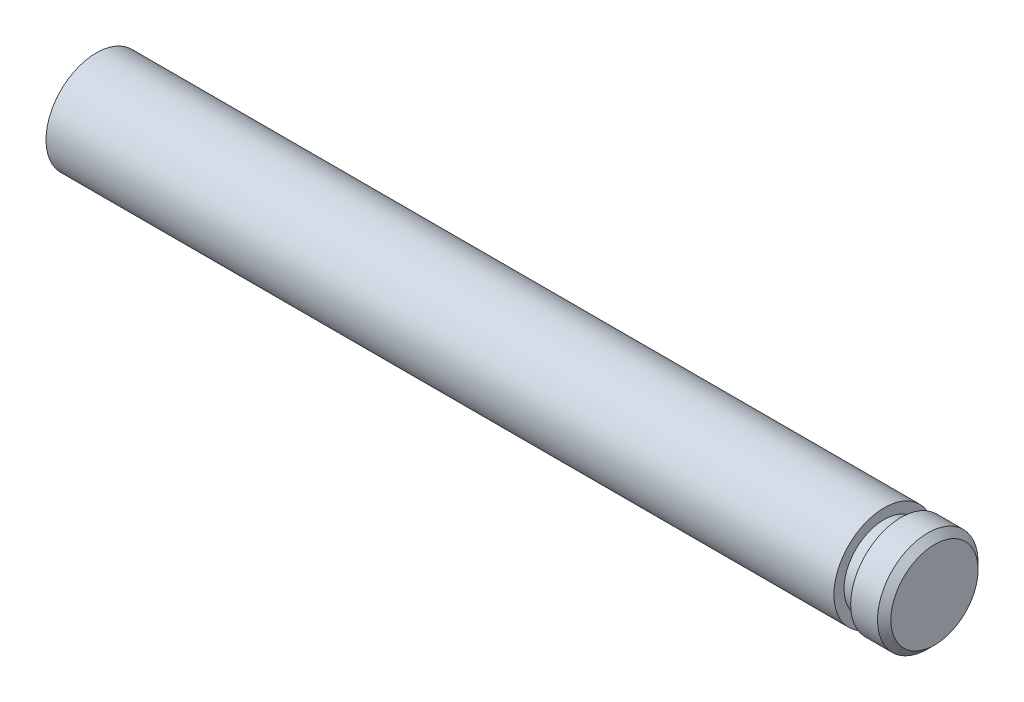
ISO-10303-21;
HEADER;
FILE_DESCRIPTION(('STEP AP214'),'2;1');
FILE_NAME('part.step','',(''),(''),'','','');
FILE_SCHEMA(('AUTOMOTIVE_DESIGN { 1 0 10303 214 1 1 1 1 }'));
ENDSEC;
DATA;
#1=APPLICATION_CONTEXT('core data for automotive mechanical design processes');
#2=APPLICATION_PROTOCOL_DEFINITION('international standard','automotive_design',2000,#1);
#3=PRODUCT_CONTEXT('',#1,'mechanical');
#4=PRODUCT('Part','Part','',(#3));
#5=PRODUCT_RELATED_PRODUCT_CATEGORY('part','',(#4));
#6=PRODUCT_DEFINITION_FORMATION('','',#4);
#7=PRODUCT_DEFINITION_CONTEXT('part definition',#1,'design');
#8=PRODUCT_DEFINITION('design','',#6,#7);
#9=PRODUCT_DEFINITION_SHAPE('','',#8);
#10=(LENGTH_UNIT() NAMED_UNIT(*) SI_UNIT(.MILLI.,.METRE.));
#11=(NAMED_UNIT(*) PLANE_ANGLE_UNIT() SI_UNIT($,.RADIAN.));
#12=(NAMED_UNIT(*) SI_UNIT($,.STERADIAN.) SOLID_ANGLE_UNIT());
#13=UNCERTAINTY_MEASURE_WITH_UNIT(LENGTH_MEASURE(1.E-05),#10,'distance_accuracy_value','');
#14=(GEOMETRIC_REPRESENTATION_CONTEXT(3) GLOBAL_UNCERTAINTY_ASSIGNED_CONTEXT((#13)) GLOBAL_UNIT_ASSIGNED_CONTEXT((#10,
#11,#12)) REPRESENTATION_CONTEXT('',''));
#15=CARTESIAN_POINT('',(0.,0.,0.));
#16=DIRECTION('',(0.,0.,1.));
#17=DIRECTION('',(1.,0.,0.));
#18=AXIS2_PLACEMENT_3D('',#15,#16,#17);
#19=CARTESIAN_POINT('',(0.,0.,-1.5));
#20=DIRECTION('',(1.,0.,0.));
#21=DIRECTION('',(0.,0.,-1.));
#22=AXIS2_PLACEMENT_3D('',#19,#20,#21);
#23=PLANE('',#22);
#24=CARTESIAN_POINT('',(0.,0.,0.));
#25=DIRECTION('',(-1.,0.,0.));
#26=DIRECTION('',(0.,0.,1.));
#27=AXIS2_PLACEMENT_3D('',#24,#25,#26);
#28=CIRCLE('',#27,1.5);
#29=CARTESIAN_POINT('',(0.,0.,1.5));
#30=VERTEX_POINT('',#29);
#31=EDGE_CURVE('E62',#30,#30,#28,.T.);
#32=ORIENTED_EDGE('',*,*,#31,.T.);
#33=EDGE_LOOP('',(#32));
#34=FACE_BOUND('',#33,.T.);
#35=ADVANCED_FACE('F36',(#34),#23,.F.);
#36=CARTESIAN_POINT('',(25.,0.,0.));
#37=DIRECTION('',(-1.,0.,0.));
#38=DIRECTION('',(0.,0.,1.));
#39=AXIS2_PLACEMENT_3D('',#36,#37,#38);
#40=PLANE('',#39);
#41=CARTESIAN_POINT('',(25.,0.,0.));
#42=DIRECTION('',(-1.,0.,0.));
#43=DIRECTION('',(0.,0.,1.));
#44=AXIS2_PLACEMENT_3D('',#41,#42,#43);
#45=CIRCLE('',#44,1.30000000000001);
#46=CARTESIAN_POINT('',(25.,0.,1.30000000000001));
#47=VERTEX_POINT('',#46);
#48=EDGE_CURVE('E10',#47,#47,#45,.F.);
#49=ORIENTED_EDGE('',*,*,#48,.T.);
#50=EDGE_LOOP('',(#49));
#51=FACE_BOUND('',#50,.T.);
#52=ADVANCED_FACE('F93',(#51),#40,.F.);
#53=CARTESIAN_POINT('',(0.,0.,0.));
#54=DIRECTION('',(-1.,0.,0.));
#55=DIRECTION('',(0.,0.,1.));
#56=AXIS2_PLACEMENT_3D('',#53,#54,#55);
#57=CYLINDRICAL_SURFACE('',#56,1.5);
#58=CARTESIAN_POINT('',(24.8,0.,0.));
#59=DIRECTION('',(-1.,0.,0.));
#60=DIRECTION('',(0.,0.,1.));
#61=AXIS2_PLACEMENT_3D('',#58,#59,#60);
#62=CIRCLE('',#61,1.5);
#63=CARTESIAN_POINT('',(24.8,0.,1.5));
#64=VERTEX_POINT('',#63);
#65=EDGE_CURVE('E43',#64,#64,#62,.T.);
#66=ORIENTED_EDGE('',*,*,#65,.T.);
#67=EDGE_LOOP('',(#66));
#68=FACE_BOUND('',#67,.T.);
#69=CARTESIAN_POINT('',(24.,0.,0.));
#70=DIRECTION('',(-1.,0.,0.));
#71=DIRECTION('',(0.,0.,1.));
#72=AXIS2_PLACEMENT_3D('',#69,#70,#71);
#73=CIRCLE('',#72,1.5);
#74=CARTESIAN_POINT('',(24.,0.,1.5));
#75=VERTEX_POINT('',#74);
#76=EDGE_CURVE('E47',#75,#75,#73,.T.);
#77=ORIENTED_EDGE('',*,*,#76,.F.);
#78=EDGE_LOOP('',(#77));
#79=FACE_BOUND('',#78,.T.);
#80=ADVANCED_FACE('F88',(#68,#79),#57,.T.);
#81=CARTESIAN_POINT('',(24.,0.,-1.5));
#82=DIRECTION('',(1.,0.,0.));
#83=DIRECTION('',(0.,0.,-1.));
#84=AXIS2_PLACEMENT_3D('',#81,#82,#83);
#85=PLANE('',#84);
#86=CARTESIAN_POINT('',(24.,0.,0.));
#87=DIRECTION('',(-1.,0.,0.));
#88=DIRECTION('',(0.,0.,1.));
#89=AXIS2_PLACEMENT_3D('',#86,#87,#88);
#90=CIRCLE('',#89,1.19832402234637);
#91=CARTESIAN_POINT('',(24.,0.,1.19832402234637));
#92=VERTEX_POINT('',#91);
#93=EDGE_CURVE('E51',#92,#92,#90,.T.);
#94=ORIENTED_EDGE('',*,*,#93,.F.);
#95=EDGE_LOOP('',(#94));
#96=FACE_BOUND('',#95,.T.);
#97=ORIENTED_EDGE('',*,*,#76,.T.);
#98=EDGE_LOOP('',(#97));
#99=FACE_BOUND('',#98,.T.);
#100=ADVANCED_FACE('F82',(#96,#99),#85,.F.);
#101=CARTESIAN_POINT('',(0.,0.,0.));
#102=DIRECTION('',(-1.,0.,0.));
#103=DIRECTION('',(0.,0.,1.));
#104=AXIS2_PLACEMENT_3D('',#101,#102,#103);
#105=CYLINDRICAL_SURFACE('',#104,1.19832402234637);
#106=CARTESIAN_POINT('',(23.5,0.,0.));
#107=DIRECTION('',(-1.,0.,0.));
#108=DIRECTION('',(0.,0.,1.));
#109=AXIS2_PLACEMENT_3D('',#106,#107,#108);
#110=CIRCLE('',#109,1.19832402234637);
#111=CARTESIAN_POINT('',(23.5,0.,1.19832402234637));
#112=VERTEX_POINT('',#111);
#113=EDGE_CURVE('E56',#112,#112,#110,.T.);
#114=ORIENTED_EDGE('',*,*,#113,.F.);
#115=EDGE_LOOP('',(#114));
#116=FACE_BOUND('',#115,.T.);
#117=ORIENTED_EDGE('',*,*,#93,.T.);
#118=EDGE_LOOP('',(#117));
#119=FACE_BOUND('',#118,.T.);
#120=ADVANCED_FACE('F76',(#116,#119),#105,.T.);
#121=CARTESIAN_POINT('',(23.5,0.,-1.19832402234637));
#122=DIRECTION('',(-1.,0.,0.));
#123=DIRECTION('',(0.,0.,1.));
#124=AXIS2_PLACEMENT_3D('',#121,#122,#123);
#125=PLANE('',#124);
#126=CARTESIAN_POINT('',(23.5,0.,0.));
#127=DIRECTION('',(-1.,0.,0.));
#128=DIRECTION('',(0.,0.,1.));
#129=AXIS2_PLACEMENT_3D('',#126,#127,#128);
#130=CIRCLE('',#129,1.5);
#131=CARTESIAN_POINT('',(23.5,0.,1.5));
#132=VERTEX_POINT('',#131);
#133=EDGE_CURVE('E59',#132,#132,#130,.T.);
#134=ORIENTED_EDGE('',*,*,#133,.F.);
#135=EDGE_LOOP('',(#134));
#136=FACE_BOUND('',#135,.T.);
#137=ORIENTED_EDGE('',*,*,#113,.T.);
#138=EDGE_LOOP('',(#137));
#139=FACE_BOUND('',#138,.T.);
#140=ADVANCED_FACE('F70',(#136,#139),#125,.F.);
#141=CARTESIAN_POINT('',(0.,0.,0.));
#142=DIRECTION('',(-1.,0.,0.));
#143=DIRECTION('',(0.,0.,1.));
#144=AXIS2_PLACEMENT_3D('',#141,#142,#143);
#145=CYLINDRICAL_SURFACE('',#144,1.5);
#146=ORIENTED_EDGE('',*,*,#31,.F.);
#147=EDGE_LOOP('',(#146));
#148=FACE_BOUND('',#147,.T.);
#149=ORIENTED_EDGE('',*,*,#133,.T.);
#150=EDGE_LOOP('',(#149));
#151=FACE_BOUND('',#150,.T.);
#152=ADVANCED_FACE('F67',(#148,#151),#145,.T.);
#153=CARTESIAN_POINT('',(24.8,0.,0.));
#154=DIRECTION('',(-1.,0.,0.));
#155=DIRECTION('',(0.,0.,1.));
#156=AXIS2_PLACEMENT_3D('',#153,#154,#155);
#157=CONICAL_SURFACE('',#156,1.5,0.785398163397448);
#158=ORIENTED_EDGE('',*,*,#48,.F.);
#159=EDGE_LOOP('',(#158));
#160=FACE_BOUND('',#159,.T.);
#161=ORIENTED_EDGE('',*,*,#65,.F.);
#162=EDGE_LOOP('',(#161));
#163=FACE_BOUND('',#162,.T.);
#164=ADVANCED_FACE('F38',(#160,#163),#157,.T.);
#165=CLOSED_SHELL('',(#35,#52,#80,#100,#120,#140,#152,#164));
#166=MANIFOLD_SOLID_BREP('B2',#165);
#167=ADVANCED_BREP_SHAPE_REPRESENTATION('',(#18,#166),#14);
#168=SHAPE_DEFINITION_REPRESENTATION(#9,#167);
ENDSEC;
END-ISO-10303-21;
